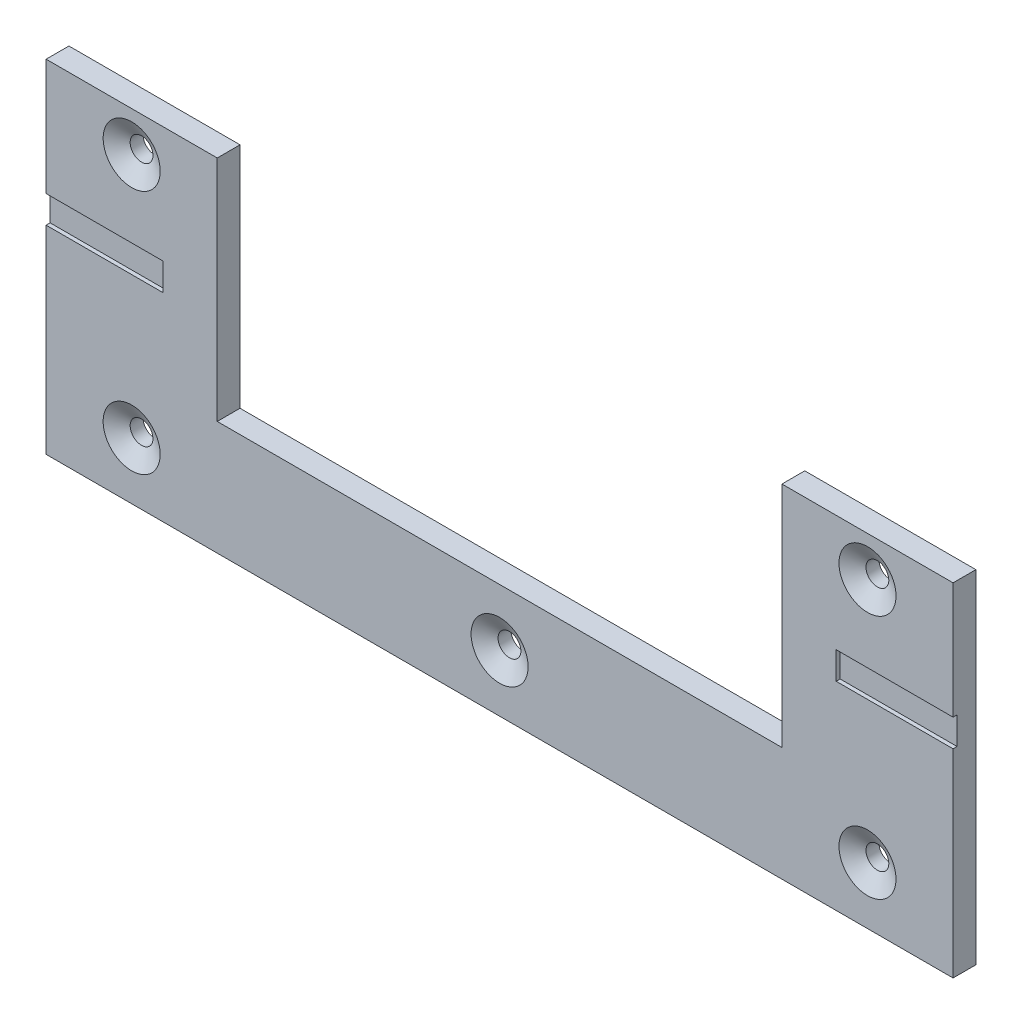
ISO-10303-21;
HEADER;
FILE_DESCRIPTION(('STEP AP214'),'2;1');
FILE_NAME('part.step','',(''),(''),'','','');
FILE_SCHEMA(('AUTOMOTIVE_DESIGN { 1 0 10303 214 1 1 1 1 }'));
ENDSEC;
DATA;
#1=APPLICATION_CONTEXT('core data for automotive mechanical design processes');
#2=APPLICATION_PROTOCOL_DEFINITION('international standard','automotive_design',2000,#1);
#3=PRODUCT_CONTEXT('',#1,'mechanical');
#4=PRODUCT('Part','Part','',(#3));
#5=PRODUCT_RELATED_PRODUCT_CATEGORY('part','',(#4));
#6=PRODUCT_DEFINITION_FORMATION('','',#4);
#7=PRODUCT_DEFINITION_CONTEXT('part definition',#1,'design');
#8=PRODUCT_DEFINITION('design','',#6,#7);
#9=PRODUCT_DEFINITION_SHAPE('','',#8);
#10=(LENGTH_UNIT() NAMED_UNIT(*) SI_UNIT(.MILLI.,.METRE.));
#11=(NAMED_UNIT(*) PLANE_ANGLE_UNIT() SI_UNIT($,.RADIAN.));
#12=(NAMED_UNIT(*) SI_UNIT($,.STERADIAN.) SOLID_ANGLE_UNIT());
#13=UNCERTAINTY_MEASURE_WITH_UNIT(LENGTH_MEASURE(1.E-05),#10,'distance_accuracy_value','');
#14=(GEOMETRIC_REPRESENTATION_CONTEXT(3) GLOBAL_UNCERTAINTY_ASSIGNED_CONTEXT((#13)) GLOBAL_UNIT_ASSIGNED_CONTEXT((#10,
#11,#12)) REPRESENTATION_CONTEXT('',''));
#15=CARTESIAN_POINT('',(0.,0.,0.));
#16=DIRECTION('',(0.,0.,1.));
#17=DIRECTION('',(1.,0.,0.));
#18=AXIS2_PLACEMENT_3D('',#15,#16,#17);
#19=CARTESIAN_POINT('',(0.,60.,4.));
#20=DIRECTION('',(0.,-1.,0.));
#21=DIRECTION('',(0.,0.,-1.));
#22=AXIS2_PLACEMENT_3D('',#19,#20,#21);
#23=PLANE('',#22);
#24=DIRECTION('',(-1.,0.,0.));
#25=VECTOR('',#24,1.);
#26=CARTESIAN_POINT('',(0.,60.,4.));
#27=LINE('',#26,#25);
#28=CARTESIAN_POINT('',(30.,60.,4.));
#29=VERTEX_POINT('',#28);
#30=CARTESIAN_POINT('',(0.,60.,4.));
#31=VERTEX_POINT('',#30);
#32=EDGE_CURVE('E279',#29,#31,#27,.T.);
#33=ORIENTED_EDGE('',*,*,#32,.F.);
#34=DIRECTION('',(0.,0.,1.));
#35=VECTOR('',#34,1.);
#36=CARTESIAN_POINT('',(30.,60.,0.));
#37=LINE('',#36,#35);
#38=CARTESIAN_POINT('',(30.,60.,0.));
#39=VERTEX_POINT('',#38);
#40=EDGE_CURVE('E180',#39,#29,#37,.T.);
#41=ORIENTED_EDGE('',*,*,#40,.F.);
#42=DIRECTION('',(-1.,0.,0.));
#43=VECTOR('',#42,1.);
#44=CARTESIAN_POINT('',(0.,60.,0.));
#45=LINE('',#44,#43);
#46=CARTESIAN_POINT('',(0.,60.,0.));
#47=VERTEX_POINT('',#46);
#48=EDGE_CURVE('E168',#39,#47,#45,.T.);
#49=ORIENTED_EDGE('',*,*,#48,.T.);
#50=DIRECTION('',(0.,0.,-1.));
#51=VECTOR('',#50,1.);
#52=CARTESIAN_POINT('',(0.,60.,4.));
#53=LINE('',#52,#51);
#54=EDGE_CURVE('E283',#31,#47,#53,.T.);
#55=ORIENTED_EDGE('',*,*,#54,.F.);
#56=EDGE_LOOP('',(#33,#41,#49,#55));
#57=FACE_BOUND('',#56,.T.);
#58=ADVANCED_FACE('F33',(#57),#23,.F.);
#59=CARTESIAN_POINT('',(0.,0.,4.));
#60=DIRECTION('',(0.,0.,-1.));
#61=DIRECTION('',(-1.,0.,0.));
#62=AXIS2_PLACEMENT_3D('',#59,#60,#61);
#63=PLANE('',#62);
#64=CARTESIAN_POINT('',(79.5,10.,4.));
#65=DIRECTION('',(0.,0.,-1.));
#66=DIRECTION('',(-1.,0.,0.));
#67=AXIS2_PLACEMENT_3D('',#64,#65,#66);
#68=CIRCLE('',#67,5.);
#69=CARTESIAN_POINT('',(74.5,10.,4.));
#70=VERTEX_POINT('',#69);
#71=EDGE_CURVE('E319',#70,#70,#68,.T.);
#72=ORIENTED_EDGE('',*,*,#71,.T.);
#73=EDGE_LOOP('',(#72));
#74=FACE_BOUND('',#73,.T.);
#75=CARTESIAN_POINT('',(144.,53.,4.));
#76=DIRECTION('',(0.,0.,-1.));
#77=DIRECTION('',(-1.,0.,0.));
#78=AXIS2_PLACEMENT_3D('',#75,#76,#77);
#79=CIRCLE('',#78,5.);
#80=CARTESIAN_POINT('',(139.,53.,4.));
#81=VERTEX_POINT('',#80);
#82=EDGE_CURVE('E316',#81,#81,#79,.T.);
#83=ORIENTED_EDGE('',*,*,#82,.T.);
#84=EDGE_LOOP('',(#83));
#85=FACE_BOUND('',#84,.T.);
#86=CARTESIAN_POINT('',(144.,10.,4.));
#87=DIRECTION('',(0.,0.,-1.));
#88=DIRECTION('',(-1.,0.,0.));
#89=AXIS2_PLACEMENT_3D('',#86,#87,#88);
#90=CIRCLE('',#89,5.);
#91=CARTESIAN_POINT('',(139.,10.,4.));
#92=VERTEX_POINT('',#91);
#93=EDGE_CURVE('E313',#92,#92,#90,.T.);
#94=ORIENTED_EDGE('',*,*,#93,.T.);
#95=EDGE_LOOP('',(#94));
#96=FACE_BOUND('',#95,.T.);
#97=CARTESIAN_POINT('',(15.,10.,4.));
#98=DIRECTION('',(0.,0.,-1.));
#99=DIRECTION('',(-1.,0.,0.));
#100=AXIS2_PLACEMENT_3D('',#97,#98,#99);
#101=CIRCLE('',#100,5.);
#102=CARTESIAN_POINT('',(20.,10.,4.));
#103=VERTEX_POINT('',#102);
#104=EDGE_CURVE('E310',#103,#103,#101,.T.);
#105=ORIENTED_EDGE('',*,*,#104,.T.);
#106=EDGE_LOOP('',(#105));
#107=FACE_BOUND('',#106,.T.);
#108=CARTESIAN_POINT('',(15.,53.,4.));
#109=DIRECTION('',(0.,0.,-1.));
#110=DIRECTION('',(-1.,0.,0.));
#111=AXIS2_PLACEMENT_3D('',#108,#109,#110);
#112=CIRCLE('',#111,5.);
#113=CARTESIAN_POINT('',(20.,53.,4.));
#114=VERTEX_POINT('',#113);
#115=EDGE_CURVE('E307',#114,#114,#112,.T.);
#116=ORIENTED_EDGE('',*,*,#115,.T.);
#117=EDGE_LOOP('',(#116));
#118=FACE_BOUND('',#117,.T.);
#119=DIRECTION('',(1.,0.,0.));
#120=VECTOR('',#119,1.);
#121=CARTESIAN_POINT('',(30.,20.,4.));
#122=LINE('',#121,#120);
#123=CARTESIAN_POINT('',(30.,20.,4.));
#124=VERTEX_POINT('',#123);
#125=CARTESIAN_POINT('',(129.,20.,4.));
#126=VERTEX_POINT('',#125);
#127=EDGE_CURVE('E171',#124,#126,#122,.T.);
#128=ORIENTED_EDGE('',*,*,#127,.F.);
#129=DIRECTION('',(0.,-1.,0.));
#130=VECTOR('',#129,1.);
#131=CARTESIAN_POINT('',(30.,60.,4.));
#132=LINE('',#131,#130);
#133=EDGE_CURVE('E153',#29,#124,#132,.T.);
#134=ORIENTED_EDGE('',*,*,#133,.F.);
#135=ORIENTED_EDGE('',*,*,#32,.T.);
#136=DIRECTION('',(0.,-1.,0.));
#137=VECTOR('',#136,1.);
#138=CARTESIAN_POINT('',(0.,0.,4.));
#139=LINE('',#138,#137);
#140=CARTESIAN_POINT('',(0.,39.6,4.));
#141=VERTEX_POINT('',#140);
#142=EDGE_CURVE('E269',#31,#141,#139,.T.);
#143=ORIENTED_EDGE('',*,*,#142,.T.);
#144=DIRECTION('',(1.,0.,0.));
#145=VECTOR('',#144,1.);
#146=CARTESIAN_POINT('',(20.5,39.6,4.));
#147=LINE('',#146,#145);
#148=CARTESIAN_POINT('',(20.5,39.6,4.));
#149=VERTEX_POINT('',#148);
#150=EDGE_CURVE('E243',#141,#149,#147,.T.);
#151=ORIENTED_EDGE('',*,*,#150,.T.);
#152=DIRECTION('',(0.,-1.,0.));
#153=VECTOR('',#152,1.);
#154=CARTESIAN_POINT('',(20.5,34.8,4.));
#155=LINE('',#154,#153);
#156=CARTESIAN_POINT('',(20.5,34.8,4.));
#157=VERTEX_POINT('',#156);
#158=EDGE_CURVE('E238',#149,#157,#155,.T.);
#159=ORIENTED_EDGE('',*,*,#158,.T.);
#160=DIRECTION('',(-1.,0.,0.));
#161=VECTOR('',#160,1.);
#162=CARTESIAN_POINT('',(20.5,34.8,4.));
#163=LINE('',#162,#161);
#164=CARTESIAN_POINT('',(0.,34.8,4.));
#165=VERTEX_POINT('',#164);
#166=EDGE_CURVE('E253',#157,#165,#163,.T.);
#167=ORIENTED_EDGE('',*,*,#166,.T.);
#168=CARTESIAN_POINT('',(0.,0.,4.));
#169=VERTEX_POINT('',#168);
#170=EDGE_CURVE('E273',#165,#169,#139,.T.);
#171=ORIENTED_EDGE('',*,*,#170,.T.);
#172=DIRECTION('',(1.,0.,0.));
#173=VECTOR('',#172,1.);
#174=CARTESIAN_POINT('',(0.,0.,4.));
#175=LINE('',#174,#173);
#176=CARTESIAN_POINT('',(159.,0.,4.));
#177=VERTEX_POINT('',#176);
#178=EDGE_CURVE('E272',#169,#177,#175,.T.);
#179=ORIENTED_EDGE('',*,*,#178,.T.);
#180=DIRECTION('',(0.,1.,0.));
#181=VECTOR('',#180,1.);
#182=CARTESIAN_POINT('',(159.,0.,4.));
#183=LINE('',#182,#181);
#184=CARTESIAN_POINT('',(159.,34.8,4.));
#185=VERTEX_POINT('',#184);
#186=EDGE_CURVE('E276',#177,#185,#183,.T.);
#187=ORIENTED_EDGE('',*,*,#186,.T.);
#188=DIRECTION('',(-1.,0.,0.));
#189=VECTOR('',#188,1.);
#190=CARTESIAN_POINT('',(138.5,34.8,4.));
#191=LINE('',#190,#189);
#192=CARTESIAN_POINT('',(138.5,34.8,4.));
#193=VERTEX_POINT('',#192);
#194=EDGE_CURVE('E215',#185,#193,#191,.T.);
#195=ORIENTED_EDGE('',*,*,#194,.T.);
#196=DIRECTION('',(0.,1.,0.));
#197=VECTOR('',#196,1.);
#198=CARTESIAN_POINT('',(138.5,34.8,4.));
#199=LINE('',#198,#197);
#200=CARTESIAN_POINT('',(138.5,39.6,4.));
#201=VERTEX_POINT('',#200);
#202=EDGE_CURVE('E208',#193,#201,#199,.T.);
#203=ORIENTED_EDGE('',*,*,#202,.T.);
#204=DIRECTION('',(1.,0.,0.));
#205=VECTOR('',#204,1.);
#206=CARTESIAN_POINT('',(138.5,39.6,4.));
#207=LINE('',#206,#205);
#208=CARTESIAN_POINT('',(159.,39.6,4.));
#209=VERTEX_POINT('',#208);
#210=EDGE_CURVE('E224',#201,#209,#207,.T.);
#211=ORIENTED_EDGE('',*,*,#210,.T.);
#212=CARTESIAN_POINT('',(159.,60.,4.));
#213=VERTEX_POINT('',#212);
#214=EDGE_CURVE('E275',#209,#213,#183,.T.);
#215=ORIENTED_EDGE('',*,*,#214,.T.);
#216=CARTESIAN_POINT('',(129.,60.,4.));
#217=VERTEX_POINT('',#216);
#218=EDGE_CURVE('E280',#213,#217,#27,.T.);
#219=ORIENTED_EDGE('',*,*,#218,.T.);
#220=DIRECTION('',(0.,1.,0.));
#221=VECTOR('',#220,1.);
#222=CARTESIAN_POINT('',(129.,60.,4.));
#223=LINE('',#222,#221);
#224=EDGE_CURVE('E169',#126,#217,#223,.T.);
#225=ORIENTED_EDGE('',*,*,#224,.F.);
#226=EDGE_LOOP('',(#128,#134,#135,#143,#151,#159,#167,#171,#179,#187,#195,#203,#211,#215,#219,#225));
#227=FACE_BOUND('',#226,.T.);
#228=ADVANCED_FACE('F347',(#74,#85,#96,#107,#118,#227),#63,.F.);
#229=CARTESIAN_POINT('',(159.,0.,4.));
#230=DIRECTION('',(-1.,0.,0.));
#231=DIRECTION('',(0.,0.,1.));
#232=AXIS2_PLACEMENT_3D('',#229,#230,#231);
#233=PLANE('',#232);
#234=DIRECTION('',(0.,0.,1.));
#235=VECTOR('',#234,1.);
#236=CARTESIAN_POINT('',(159.,39.6,3.3));
#237=LINE('',#236,#235);
#238=CARTESIAN_POINT('',(159.,39.6,3.3));
#239=VERTEX_POINT('',#238);
#240=EDGE_CURVE('E233',#239,#209,#237,.T.);
#241=ORIENTED_EDGE('',*,*,#240,.F.);
#242=DIRECTION('',(0.,-1.,0.));
#243=VECTOR('',#242,1.);
#244=CARTESIAN_POINT('',(159.,34.8,3.3));
#245=LINE('',#244,#243);
#246=CARTESIAN_POINT('',(159.,34.8,3.3));
#247=VERTEX_POINT('',#246);
#248=EDGE_CURVE('E217',#239,#247,#245,.T.);
#249=ORIENTED_EDGE('',*,*,#248,.T.);
#250=DIRECTION('',(0.,0.,1.));
#251=VECTOR('',#250,1.);
#252=CARTESIAN_POINT('',(159.,34.8,3.3));
#253=LINE('',#252,#251);
#254=EDGE_CURVE('E230',#247,#185,#253,.T.);
#255=ORIENTED_EDGE('',*,*,#254,.T.);
#256=ORIENTED_EDGE('',*,*,#186,.F.);
#257=DIRECTION('',(0.,0.,-1.));
#258=VECTOR('',#257,1.);
#259=CARTESIAN_POINT('',(159.,0.,4.));
#260=LINE('',#259,#258);
#261=CARTESIAN_POINT('',(159.,0.,0.));
#262=VERTEX_POINT('',#261);
#263=EDGE_CURVE('E298',#177,#262,#260,.T.);
#264=ORIENTED_EDGE('',*,*,#263,.T.);
#265=DIRECTION('',(0.,1.,0.));
#266=VECTOR('',#265,1.);
#267=CARTESIAN_POINT('',(159.,0.,0.));
#268=LINE('',#267,#266);
#269=CARTESIAN_POINT('',(159.,60.,0.));
#270=VERTEX_POINT('',#269);
#271=EDGE_CURVE('E288',#262,#270,#268,.T.);
#272=ORIENTED_EDGE('',*,*,#271,.T.);
#273=DIRECTION('',(0.,0.,-1.));
#274=VECTOR('',#273,1.);
#275=CARTESIAN_POINT('',(159.,60.,4.));
#276=LINE('',#275,#274);
#277=EDGE_CURVE('E295',#213,#270,#276,.T.);
#278=ORIENTED_EDGE('',*,*,#277,.F.);
#279=ORIENTED_EDGE('',*,*,#214,.F.);
#280=EDGE_LOOP('',(#241,#249,#255,#256,#264,#272,#278,#279));
#281=FACE_BOUND('',#280,.T.);
#282=ADVANCED_FACE('F354',(#281),#233,.F.);
#283=CARTESIAN_POINT('',(0.,0.,4.));
#284=DIRECTION('',(1.,0.,0.));
#285=DIRECTION('',(0.,0.,-1.));
#286=AXIS2_PLACEMENT_3D('',#283,#284,#285);
#287=PLANE('',#286);
#288=DIRECTION('',(0.,0.,1.));
#289=VECTOR('',#288,1.);
#290=CARTESIAN_POINT('',(0.,34.8,3.3));
#291=LINE('',#290,#289);
#292=CARTESIAN_POINT('',(0.,34.8,3.3));
#293=VERTEX_POINT('',#292);
#294=EDGE_CURVE('E263',#293,#165,#291,.T.);
#295=ORIENTED_EDGE('',*,*,#294,.F.);
#296=DIRECTION('',(0.,1.,0.));
#297=VECTOR('',#296,1.);
#298=CARTESIAN_POINT('',(0.,34.8,3.3));
#299=LINE('',#298,#297);
#300=CARTESIAN_POINT('',(0.,39.6,3.3));
#301=VERTEX_POINT('',#300);
#302=EDGE_CURVE('E245',#293,#301,#299,.T.);
#303=ORIENTED_EDGE('',*,*,#302,.T.);
#304=DIRECTION('',(0.,0.,1.));
#305=VECTOR('',#304,1.);
#306=CARTESIAN_POINT('',(0.,39.6,3.3));
#307=LINE('',#306,#305);
#308=EDGE_CURVE('E260',#301,#141,#307,.T.);
#309=ORIENTED_EDGE('',*,*,#308,.T.);
#310=ORIENTED_EDGE('',*,*,#142,.F.);
#311=ORIENTED_EDGE('',*,*,#54,.T.);
#312=DIRECTION('',(0.,-1.,0.));
#313=VECTOR('',#312,1.);
#314=CARTESIAN_POINT('',(0.,0.,0.));
#315=LINE('',#314,#313);
#316=CARTESIAN_POINT('',(0.,0.,0.));
#317=VERTEX_POINT('',#316);
#318=EDGE_CURVE('E268',#47,#317,#315,.T.);
#319=ORIENTED_EDGE('',*,*,#318,.T.);
#320=DIRECTION('',(0.,0.,-1.));
#321=VECTOR('',#320,1.);
#322=CARTESIAN_POINT('',(0.,0.,4.));
#323=LINE('',#322,#321);
#324=EDGE_CURVE('E301',#169,#317,#323,.T.);
#325=ORIENTED_EDGE('',*,*,#324,.F.);
#326=ORIENTED_EDGE('',*,*,#170,.F.);
#327=EDGE_LOOP('',(#295,#303,#309,#310,#311,#319,#325,#326));
#328=FACE_BOUND('',#327,.T.);
#329=ADVANCED_FACE('F369',(#328),#287,.F.);
#330=CARTESIAN_POINT('',(0.,0.,4.));
#331=DIRECTION('',(0.,1.,0.));
#332=DIRECTION('',(0.,0.,1.));
#333=AXIS2_PLACEMENT_3D('',#330,#331,#332);
#334=PLANE('',#333);
#335=DIRECTION('',(1.,0.,0.));
#336=VECTOR('',#335,1.);
#337=CARTESIAN_POINT('',(0.,0.,0.));
#338=LINE('',#337,#336);
#339=EDGE_CURVE('E286',#317,#262,#338,.T.);
#340=ORIENTED_EDGE('',*,*,#339,.T.);
#341=ORIENTED_EDGE('',*,*,#263,.F.);
#342=ORIENTED_EDGE('',*,*,#178,.F.);
#343=ORIENTED_EDGE('',*,*,#324,.T.);
#344=EDGE_LOOP('',(#340,#341,#342,#343));
#345=FACE_BOUND('',#344,.T.);
#346=ADVANCED_FACE('F361',(#345),#334,.F.);
#347=CARTESIAN_POINT('',(129.,60.,0.));
#348=VERTEX_POINT('',#347);
#349=EDGE_CURVE('E290',#270,#348,#45,.T.);
#350=ORIENTED_EDGE('',*,*,#349,.T.);
#351=DIRECTION('',(0.,0.,1.));
#352=VECTOR('',#351,1.);
#353=CARTESIAN_POINT('',(129.,60.,0.));
#354=LINE('',#353,#352);
#355=EDGE_CURVE('E183',#348,#217,#354,.T.);
#356=ORIENTED_EDGE('',*,*,#355,.T.);
#357=ORIENTED_EDGE('',*,*,#218,.F.);
#358=ORIENTED_EDGE('',*,*,#277,.T.);
#359=EDGE_LOOP('',(#350,#356,#357,#358));
#360=FACE_BOUND('',#359,.T.);
#361=ADVANCED_FACE('F350',(#360),#23,.F.);
#362=CARTESIAN_POINT('',(0.,0.,0.));
#363=DIRECTION('',(0.,0.,-1.));
#364=DIRECTION('',(-1.,0.,0.));
#365=AXIS2_PLACEMENT_3D('',#362,#363,#364);
#366=PLANE('',#365);
#367=CARTESIAN_POINT('',(79.5,10.,0.));
#368=DIRECTION('',(0.,0.,1.));
#369=DIRECTION('',(1.,0.,0.));
#370=AXIS2_PLACEMENT_3D('',#367,#368,#369);
#371=CIRCLE('',#370,2.);
#372=CARTESIAN_POINT('',(81.5,10.,0.));
#373=VERTEX_POINT('',#372);
#374=EDGE_CURVE('E679',#373,#373,#371,.T.);
#375=ORIENTED_EDGE('',*,*,#374,.T.);
#376=EDGE_LOOP('',(#375));
#377=FACE_BOUND('',#376,.T.);
#378=CARTESIAN_POINT('',(144.,53.,0.));
#379=DIRECTION('',(0.,0.,1.));
#380=DIRECTION('',(1.,0.,0.));
#381=AXIS2_PLACEMENT_3D('',#378,#379,#380);
#382=CIRCLE('',#381,2.);
#383=CARTESIAN_POINT('',(146.,53.,0.));
#384=VERTEX_POINT('',#383);
#385=EDGE_CURVE('E676',#384,#384,#382,.T.);
#386=ORIENTED_EDGE('',*,*,#385,.T.);
#387=EDGE_LOOP('',(#386));
#388=FACE_BOUND('',#387,.T.);
#389=CARTESIAN_POINT('',(15.,53.,0.));
#390=DIRECTION('',(0.,0.,1.));
#391=DIRECTION('',(1.,0.,0.));
#392=AXIS2_PLACEMENT_3D('',#389,#390,#391);
#393=CIRCLE('',#392,2.);
#394=CARTESIAN_POINT('',(17.,53.,0.));
#395=VERTEX_POINT('',#394);
#396=EDGE_CURVE('E678',#395,#395,#393,.T.);
#397=ORIENTED_EDGE('',*,*,#396,.T.);
#398=EDGE_LOOP('',(#397));
#399=FACE_BOUND('',#398,.T.);
#400=CARTESIAN_POINT('',(144.,10.,0.));
#401=DIRECTION('',(0.,0.,1.));
#402=DIRECTION('',(1.,0.,0.));
#403=AXIS2_PLACEMENT_3D('',#400,#401,#402);
#404=CIRCLE('',#403,2.);
#405=CARTESIAN_POINT('',(146.,10.,0.));
#406=VERTEX_POINT('',#405);
#407=EDGE_CURVE('E682',#406,#406,#404,.T.);
#408=ORIENTED_EDGE('',*,*,#407,.T.);
#409=EDGE_LOOP('',(#408));
#410=FACE_BOUND('',#409,.T.);
#411=CARTESIAN_POINT('',(15.,10.,0.));
#412=DIRECTION('',(0.,0.,1.));
#413=DIRECTION('',(1.,0.,0.));
#414=AXIS2_PLACEMENT_3D('',#411,#412,#413);
#415=CIRCLE('',#414,2.);
#416=CARTESIAN_POINT('',(17.,10.,0.));
#417=VERTEX_POINT('',#416);
#418=EDGE_CURVE('E174',#417,#417,#415,.T.);
#419=ORIENTED_EDGE('',*,*,#418,.T.);
#420=EDGE_LOOP('',(#419));
#421=FACE_BOUND('',#420,.T.);
#422=DIRECTION('',(0.,-1.,0.));
#423=VECTOR('',#422,1.);
#424=CARTESIAN_POINT('',(30.,60.,0.));
#425=LINE('',#424,#423);
#426=CARTESIAN_POINT('',(30.,20.,0.));
#427=VERTEX_POINT('',#426);
#428=EDGE_CURVE('E150',#39,#427,#425,.T.);
#429=ORIENTED_EDGE('',*,*,#428,.T.);
#430=DIRECTION('',(1.,0.,0.));
#431=VECTOR('',#430,1.);
#432=CARTESIAN_POINT('',(30.,20.,0.));
#433=LINE('',#432,#431);
#434=CARTESIAN_POINT('',(129.,20.,0.));
#435=VERTEX_POINT('',#434);
#436=EDGE_CURVE('E160',#427,#435,#433,.T.);
#437=ORIENTED_EDGE('',*,*,#436,.T.);
#438=DIRECTION('',(0.,1.,0.));
#439=VECTOR('',#438,1.);
#440=CARTESIAN_POINT('',(129.,60.,0.));
#441=LINE('',#440,#439);
#442=EDGE_CURVE('E48',#435,#348,#441,.T.);
#443=ORIENTED_EDGE('',*,*,#442,.T.);
#444=ORIENTED_EDGE('',*,*,#349,.F.);
#445=ORIENTED_EDGE('',*,*,#271,.F.);
#446=ORIENTED_EDGE('',*,*,#339,.F.);
#447=ORIENTED_EDGE('',*,*,#318,.F.);
#448=ORIENTED_EDGE('',*,*,#48,.F.);
#449=EDGE_LOOP('',(#429,#437,#443,#444,#445,#446,#447,#448));
#450=FACE_BOUND('',#449,.T.);
#451=CARTESIAN_POINT('',(146.5,43.1872690837141,0.));
#452=DIRECTION('',(0.,0.,-1.));
#453=DIRECTION('',(-1.,0.,0.));
#454=AXIS2_PLACEMENT_3D('',#451,#452,#453);
#455=CIRCLE('',#454,5.25);
#456=CARTESIAN_POINT('',(141.25,43.1872690837141,0.));
#457=VERTEX_POINT('',#456);
#458=EDGE_CURVE('E182',#457,#457,#455,.T.);
#459=ORIENTED_EDGE('',*,*,#458,.F.);
#460=EDGE_LOOP('',(#459));
#461=FACE_BOUND('',#460,.T.);
#462=CARTESIAN_POINT('',(146.5,31.2046949924377,0.));
#463=DIRECTION('',(0.,0.,-1.));
#464=DIRECTION('',(-1.,0.,0.));
#465=AXIS2_PLACEMENT_3D('',#462,#463,#464);
#466=CIRCLE('',#465,5.24999999999997);
#467=CARTESIAN_POINT('',(141.25,31.2046949924377,0.));
#468=VERTEX_POINT('',#467);
#469=EDGE_CURVE('E190',#468,#468,#466,.T.);
#470=ORIENTED_EDGE('',*,*,#469,.F.);
#471=EDGE_LOOP('',(#470));
#472=FACE_BOUND('',#471,.T.);
#473=CARTESIAN_POINT('',(12.5,43.1872690837141,0.));
#474=DIRECTION('',(0.,0.,-1.));
#475=DIRECTION('',(-1.,0.,0.));
#476=AXIS2_PLACEMENT_3D('',#473,#474,#475);
#477=CIRCLE('',#476,5.25);
#478=CARTESIAN_POINT('',(7.25,43.1872690837141,0.));
#479=VERTEX_POINT('',#478);
#480=EDGE_CURVE('E196',#479,#479,#477,.T.);
#481=ORIENTED_EDGE('',*,*,#480,.F.);
#482=EDGE_LOOP('',(#481));
#483=FACE_BOUND('',#482,.T.);
#484=CARTESIAN_POINT('',(12.5,31.1872690837141,0.));
#485=DIRECTION('',(0.,0.,-1.));
#486=DIRECTION('',(-1.,0.,0.));
#487=AXIS2_PLACEMENT_3D('',#484,#485,#486);
#488=CIRCLE('',#487,5.25);
#489=CARTESIAN_POINT('',(7.25000000000001,31.1872690837141,0.));
#490=VERTEX_POINT('',#489);
#491=EDGE_CURVE('E202',#490,#490,#488,.T.);
#492=ORIENTED_EDGE('',*,*,#491,.F.);
#493=EDGE_LOOP('',(#492));
#494=FACE_BOUND('',#493,.T.);
#495=ADVANCED_FACE('F165',(#377,#388,#399,#410,#421,#450,#461,#472,#483,#494),#366,.T.);
#496=CARTESIAN_POINT('',(20.5,34.8,3.3));
#497=DIRECTION('',(-1.,0.,0.));
#498=DIRECTION('',(0.,0.,1.));
#499=AXIS2_PLACEMENT_3D('',#496,#497,#498);
#500=PLANE('',#499);
#501=ORIENTED_EDGE('',*,*,#158,.F.);
#502=DIRECTION('',(0.,0.,1.));
#503=VECTOR('',#502,1.);
#504=CARTESIAN_POINT('',(20.5,39.6,3.3));
#505=LINE('',#504,#503);
#506=CARTESIAN_POINT('',(20.5,39.6,3.3));
#507=VERTEX_POINT('',#506);
#508=EDGE_CURVE('E250',#507,#149,#505,.T.);
#509=ORIENTED_EDGE('',*,*,#508,.F.);
#510=DIRECTION('',(0.,-1.,0.));
#511=VECTOR('',#510,1.);
#512=CARTESIAN_POINT('',(20.5,34.8,3.3));
#513=LINE('',#512,#511);
#514=CARTESIAN_POINT('',(20.5,34.8,3.3));
#515=VERTEX_POINT('',#514);
#516=EDGE_CURVE('E239',#507,#515,#513,.T.);
#517=ORIENTED_EDGE('',*,*,#516,.T.);
#518=DIRECTION('',(0.,0.,1.));
#519=VECTOR('',#518,1.);
#520=CARTESIAN_POINT('',(20.5,34.8,3.3));
#521=LINE('',#520,#519);
#522=EDGE_CURVE('E265',#515,#157,#521,.T.);
#523=ORIENTED_EDGE('',*,*,#522,.T.);
#524=EDGE_LOOP('',(#501,#509,#517,#523));
#525=FACE_BOUND('',#524,.T.);
#526=ADVANCED_FACE('F367',(#525),#500,.T.);
#527=CARTESIAN_POINT('',(20.5,34.8,3.3));
#528=DIRECTION('',(0.,1.,0.));
#529=DIRECTION('',(0.,0.,1.));
#530=AXIS2_PLACEMENT_3D('',#527,#528,#529);
#531=PLANE('',#530);
#532=ORIENTED_EDGE('',*,*,#166,.F.);
#533=ORIENTED_EDGE('',*,*,#522,.F.);
#534=DIRECTION('',(-1.,0.,0.));
#535=VECTOR('',#534,1.);
#536=CARTESIAN_POINT('',(20.5,34.8,3.3));
#537=LINE('',#536,#535);
#538=EDGE_CURVE('E242',#515,#293,#537,.T.);
#539=ORIENTED_EDGE('',*,*,#538,.T.);
#540=ORIENTED_EDGE('',*,*,#294,.T.);
#541=EDGE_LOOP('',(#532,#533,#539,#540));
#542=FACE_BOUND('',#541,.T.);
#543=ADVANCED_FACE('F456',(#542),#531,.T.);
#544=CARTESIAN_POINT('',(20.5,39.6,3.3));
#545=DIRECTION('',(0.,-1.,0.));
#546=DIRECTION('',(0.,0.,-1.));
#547=AXIS2_PLACEMENT_3D('',#544,#545,#546);
#548=PLANE('',#547);
#549=ORIENTED_EDGE('',*,*,#150,.F.);
#550=ORIENTED_EDGE('',*,*,#308,.F.);
#551=DIRECTION('',(1.,0.,0.));
#552=VECTOR('',#551,1.);
#553=CARTESIAN_POINT('',(20.5,39.6,3.3));
#554=LINE('',#553,#552);
#555=EDGE_CURVE('E248',#301,#507,#554,.T.);
#556=ORIENTED_EDGE('',*,*,#555,.T.);
#557=ORIENTED_EDGE('',*,*,#508,.T.);
#558=EDGE_LOOP('',(#549,#550,#556,#557));
#559=FACE_BOUND('',#558,.T.);
#560=ADVANCED_FACE('F452',(#559),#548,.T.);
#561=CARTESIAN_POINT('',(0.,0.,3.3));
#562=DIRECTION('',(0.,0.,1.));
#563=DIRECTION('',(1.,0.,0.));
#564=AXIS2_PLACEMENT_3D('',#561,#562,#563);
#565=PLANE('',#564);
#566=ORIENTED_EDGE('',*,*,#516,.F.);
#567=ORIENTED_EDGE('',*,*,#555,.F.);
#568=ORIENTED_EDGE('',*,*,#302,.F.);
#569=ORIENTED_EDGE('',*,*,#538,.F.);
#570=EDGE_LOOP('',(#566,#567,#568,#569));
#571=FACE_BOUND('',#570,.T.);
#572=ADVANCED_FACE('F448',(#571),#565,.T.);
#573=CARTESIAN_POINT('',(138.5,34.8,3.3));
#574=DIRECTION('',(1.,0.,0.));
#575=DIRECTION('',(0.,0.,-1.));
#576=AXIS2_PLACEMENT_3D('',#573,#574,#575);
#577=PLANE('',#576);
#578=ORIENTED_EDGE('',*,*,#202,.F.);
#579=DIRECTION('',(0.,0.,1.));
#580=VECTOR('',#579,1.);
#581=CARTESIAN_POINT('',(138.5,34.8,3.3));
#582=LINE('',#581,#580);
#583=CARTESIAN_POINT('',(138.5,34.8,3.3));
#584=VERTEX_POINT('',#583);
#585=EDGE_CURVE('E221',#584,#193,#582,.T.);
#586=ORIENTED_EDGE('',*,*,#585,.F.);
#587=DIRECTION('',(0.,1.,0.));
#588=VECTOR('',#587,1.);
#589=CARTESIAN_POINT('',(138.5,34.8,3.3));
#590=LINE('',#589,#588);
#591=CARTESIAN_POINT('',(138.5,39.6,3.3));
#592=VERTEX_POINT('',#591);
#593=EDGE_CURVE('E211',#584,#592,#590,.T.);
#594=ORIENTED_EDGE('',*,*,#593,.T.);
#595=DIRECTION('',(0.,0.,1.));
#596=VECTOR('',#595,1.);
#597=CARTESIAN_POINT('',(138.5,39.6,3.3));
#598=LINE('',#597,#596);
#599=EDGE_CURVE('E235',#592,#201,#598,.T.);
#600=ORIENTED_EDGE('',*,*,#599,.T.);
#601=EDGE_LOOP('',(#578,#586,#594,#600));
#602=FACE_BOUND('',#601,.T.);
#603=ADVANCED_FACE('F444',(#602),#577,.T.);
#604=CARTESIAN_POINT('',(138.5,39.6,3.3));
#605=DIRECTION('',(0.,-1.,0.));
#606=DIRECTION('',(0.,0.,-1.));
#607=AXIS2_PLACEMENT_3D('',#604,#605,#606);
#608=PLANE('',#607);
#609=ORIENTED_EDGE('',*,*,#210,.F.);
#610=ORIENTED_EDGE('',*,*,#599,.F.);
#611=DIRECTION('',(1.,0.,0.));
#612=VECTOR('',#611,1.);
#613=CARTESIAN_POINT('',(138.5,39.6,3.3));
#614=LINE('',#613,#612);
#615=EDGE_CURVE('E214',#592,#239,#614,.T.);
#616=ORIENTED_EDGE('',*,*,#615,.T.);
#617=ORIENTED_EDGE('',*,*,#240,.T.);
#618=EDGE_LOOP('',(#609,#610,#616,#617));
#619=FACE_BOUND('',#618,.T.);
#620=ADVANCED_FACE('F440',(#619),#608,.T.);
#621=CARTESIAN_POINT('',(138.5,34.8,3.3));
#622=DIRECTION('',(0.,1.,0.));
#623=DIRECTION('',(-1.,0.,0.));
#624=AXIS2_PLACEMENT_3D('',#621,#622,#623);
#625=PLANE('',#624);
#626=ORIENTED_EDGE('',*,*,#194,.F.);
#627=ORIENTED_EDGE('',*,*,#254,.F.);
#628=DIRECTION('',(-1.,0.,0.));
#629=VECTOR('',#628,1.);
#630=CARTESIAN_POINT('',(138.5,34.8,3.3));
#631=LINE('',#630,#629);
#632=EDGE_CURVE('E56',#247,#584,#631,.T.);
#633=ORIENTED_EDGE('',*,*,#632,.T.);
#634=ORIENTED_EDGE('',*,*,#585,.T.);
#635=EDGE_LOOP('',(#626,#627,#633,#634));
#636=FACE_BOUND('',#635,.T.);
#637=ADVANCED_FACE('F437',(#636),#625,.T.);
#638=CARTESIAN_POINT('',(0.,0.,3.3));
#639=DIRECTION('',(0.,0.,-1.));
#640=DIRECTION('',(-1.,0.,0.));
#641=AXIS2_PLACEMENT_3D('',#638,#639,#640);
#642=PLANE('',#641);
#643=ORIENTED_EDGE('',*,*,#593,.F.);
#644=ORIENTED_EDGE('',*,*,#632,.F.);
#645=ORIENTED_EDGE('',*,*,#248,.F.);
#646=ORIENTED_EDGE('',*,*,#615,.F.);
#647=EDGE_LOOP('',(#643,#644,#645,#646));
#648=FACE_BOUND('',#647,.T.);
#649=ADVANCED_FACE('F433',(#648),#642,.F.);
#650=CARTESIAN_POINT('',(12.5,31.1872690837141,2.3));
#651=DIRECTION('',(0.,0.,-1.));
#652=DIRECTION('',(-1.,0.,0.));
#653=AXIS2_PLACEMENT_3D('',#650,#651,#652);
#654=CYLINDRICAL_SURFACE('',#653,5.25);
#655=CARTESIAN_POINT('',(12.5,31.1872690837141,2.3));
#656=DIRECTION('',(0.,0.,-1.));
#657=DIRECTION('',(-1.,0.,0.));
#658=AXIS2_PLACEMENT_3D('',#655,#656,#657);
#659=CIRCLE('',#658,5.25);
#660=CARTESIAN_POINT('',(7.25000000000001,31.1872690837141,2.3));
#661=VERTEX_POINT('',#660);
#662=EDGE_CURVE('E205',#661,#661,#659,.T.);
#663=ORIENTED_EDGE('',*,*,#662,.F.);
#664=EDGE_LOOP('',(#663));
#665=FACE_BOUND('',#664,.T.);
#666=ORIENTED_EDGE('',*,*,#491,.T.);
#667=EDGE_LOOP('',(#666));
#668=FACE_BOUND('',#667,.T.);
#669=ADVANCED_FACE('F429',(#665,#668),#654,.F.);
#670=CARTESIAN_POINT('',(12.5,31.1872690837141,2.3));
#671=DIRECTION('',(0.,0.,-1.));
#672=DIRECTION('',(-1.,0.,0.));
#673=AXIS2_PLACEMENT_3D('',#670,#671,#672);
#674=PLANE('',#673);
#675=ORIENTED_EDGE('',*,*,#662,.T.);
#676=EDGE_LOOP('',(#675));
#677=FACE_BOUND('',#676,.T.);
#678=ADVANCED_FACE('F425',(#677),#674,.T.);
#679=CARTESIAN_POINT('',(12.5,43.1872690837141,2.3));
#680=DIRECTION('',(0.,0.,-1.));
#681=DIRECTION('',(-1.,0.,0.));
#682=AXIS2_PLACEMENT_3D('',#679,#680,#681);
#683=CYLINDRICAL_SURFACE('',#682,5.25);
#684=CARTESIAN_POINT('',(12.5,43.1872690837141,2.3));
#685=DIRECTION('',(0.,0.,-1.));
#686=DIRECTION('',(-1.,0.,0.));
#687=AXIS2_PLACEMENT_3D('',#684,#685,#686);
#688=CIRCLE('',#687,5.25);
#689=CARTESIAN_POINT('',(7.25,43.1872690837141,2.3));
#690=VERTEX_POINT('',#689);
#691=EDGE_CURVE('E199',#690,#690,#688,.T.);
#692=ORIENTED_EDGE('',*,*,#691,.F.);
#693=EDGE_LOOP('',(#692));
#694=FACE_BOUND('',#693,.T.);
#695=ORIENTED_EDGE('',*,*,#480,.T.);
#696=EDGE_LOOP('',(#695));
#697=FACE_BOUND('',#696,.T.);
#698=ADVANCED_FACE('F421',(#694,#697),#683,.F.);
#699=CARTESIAN_POINT('',(12.5,43.1872690837141,2.3));
#700=DIRECTION('',(0.,0.,-1.));
#701=DIRECTION('',(-1.,0.,0.));
#702=AXIS2_PLACEMENT_3D('',#699,#700,#701);
#703=PLANE('',#702);
#704=ORIENTED_EDGE('',*,*,#691,.T.);
#705=EDGE_LOOP('',(#704));
#706=FACE_BOUND('',#705,.T.);
#707=ADVANCED_FACE('F417',(#706),#703,.T.);
#708=CARTESIAN_POINT('',(146.5,31.2046949924377,2.3));
#709=DIRECTION('',(0.,0.,-1.));
#710=DIRECTION('',(-1.,0.,0.));
#711=AXIS2_PLACEMENT_3D('',#708,#709,#710);
#712=CYLINDRICAL_SURFACE('',#711,5.24999999999997);
#713=CARTESIAN_POINT('',(146.5,31.2046949924377,2.3));
#714=DIRECTION('',(0.,0.,-1.));
#715=DIRECTION('',(-1.,0.,0.));
#716=AXIS2_PLACEMENT_3D('',#713,#714,#715);
#717=CIRCLE('',#716,5.24999999999997);
#718=CARTESIAN_POINT('',(141.25,31.2046949924377,2.3));
#719=VERTEX_POINT('',#718);
#720=EDGE_CURVE('E193',#719,#719,#717,.T.);
#721=ORIENTED_EDGE('',*,*,#720,.F.);
#722=EDGE_LOOP('',(#721));
#723=FACE_BOUND('',#722,.T.);
#724=ORIENTED_EDGE('',*,*,#469,.T.);
#725=EDGE_LOOP('',(#724));
#726=FACE_BOUND('',#725,.T.);
#727=ADVANCED_FACE('F413',(#723,#726),#712,.F.);
#728=CARTESIAN_POINT('',(146.5,31.2046949924377,2.3));
#729=DIRECTION('',(0.,0.,-1.));
#730=DIRECTION('',(-1.,0.,0.));
#731=AXIS2_PLACEMENT_3D('',#728,#729,#730);
#732=PLANE('',#731);
#733=ORIENTED_EDGE('',*,*,#720,.T.);
#734=EDGE_LOOP('',(#733));
#735=FACE_BOUND('',#734,.T.);
#736=ADVANCED_FACE('F409',(#735),#732,.T.);
#737=CARTESIAN_POINT('',(146.5,43.1872690837141,2.3));
#738=DIRECTION('',(0.,0.,-1.));
#739=DIRECTION('',(-1.,0.,0.));
#740=AXIS2_PLACEMENT_3D('',#737,#738,#739);
#741=CYLINDRICAL_SURFACE('',#740,5.25);
#742=CARTESIAN_POINT('',(146.5,43.1872690837141,2.3));
#743=DIRECTION('',(0.,0.,-1.));
#744=DIRECTION('',(-1.,0.,0.));
#745=AXIS2_PLACEMENT_3D('',#742,#743,#744);
#746=CIRCLE('',#745,5.25);
#747=CARTESIAN_POINT('',(141.25,43.1872690837141,2.3));
#748=VERTEX_POINT('',#747);
#749=EDGE_CURVE('E187',#748,#748,#746,.T.);
#750=ORIENTED_EDGE('',*,*,#749,.F.);
#751=EDGE_LOOP('',(#750));
#752=FACE_BOUND('',#751,.T.);
#753=ORIENTED_EDGE('',*,*,#458,.T.);
#754=EDGE_LOOP('',(#753));
#755=FACE_BOUND('',#754,.T.);
#756=ADVANCED_FACE('F405',(#752,#755),#741,.F.);
#757=CARTESIAN_POINT('',(146.5,43.1872690837141,2.3));
#758=DIRECTION('',(0.,0.,-1.));
#759=DIRECTION('',(-1.,0.,0.));
#760=AXIS2_PLACEMENT_3D('',#757,#758,#759);
#761=PLANE('',#760);
#762=ORIENTED_EDGE('',*,*,#749,.T.);
#763=EDGE_LOOP('',(#762));
#764=FACE_BOUND('',#763,.T.);
#765=ADVANCED_FACE('F398',(#764),#761,.T.);
#766=CARTESIAN_POINT('',(30.,60.,0.));
#767=DIRECTION('',(-1.,0.,0.));
#768=DIRECTION('',(0.,-1.,0.));
#769=AXIS2_PLACEMENT_3D('',#766,#767,#768);
#770=PLANE('',#769);
#771=ORIENTED_EDGE('',*,*,#133,.T.);
#772=DIRECTION('',(0.,0.,1.));
#773=VECTOR('',#772,1.);
#774=CARTESIAN_POINT('',(30.,20.,0.));
#775=LINE('',#774,#773);
#776=EDGE_CURVE('E146',#427,#124,#775,.T.);
#777=ORIENTED_EDGE('',*,*,#776,.F.);
#778=ORIENTED_EDGE('',*,*,#428,.F.);
#779=ORIENTED_EDGE('',*,*,#40,.T.);
#780=EDGE_LOOP('',(#771,#777,#778,#779));
#781=FACE_BOUND('',#780,.T.);
#782=ADVANCED_FACE('F148',(#781),#770,.F.);
#783=CARTESIAN_POINT('',(129.,60.,0.));
#784=DIRECTION('',(1.,0.,0.));
#785=DIRECTION('',(0.,0.,-1.));
#786=AXIS2_PLACEMENT_3D('',#783,#784,#785);
#787=PLANE('',#786);
#788=ORIENTED_EDGE('',*,*,#224,.T.);
#789=ORIENTED_EDGE('',*,*,#355,.F.);
#790=ORIENTED_EDGE('',*,*,#442,.F.);
#791=DIRECTION('',(0.,0.,1.));
#792=VECTOR('',#791,1.);
#793=CARTESIAN_POINT('',(129.,20.,0.));
#794=LINE('',#793,#792);
#795=EDGE_CURVE('E157',#435,#126,#794,.T.);
#796=ORIENTED_EDGE('',*,*,#795,.T.);
#797=EDGE_LOOP('',(#788,#789,#790,#796));
#798=FACE_BOUND('',#797,.T.);
#799=ADVANCED_FACE('F390',(#798),#787,.F.);
#800=CARTESIAN_POINT('',(30.,20.,0.));
#801=DIRECTION('',(0.,-1.,0.));
#802=DIRECTION('',(0.,0.,-1.));
#803=AXIS2_PLACEMENT_3D('',#800,#801,#802);
#804=PLANE('',#803);
#805=ORIENTED_EDGE('',*,*,#127,.T.);
#806=ORIENTED_EDGE('',*,*,#795,.F.);
#807=ORIENTED_EDGE('',*,*,#436,.F.);
#808=ORIENTED_EDGE('',*,*,#776,.T.);
#809=EDGE_LOOP('',(#805,#806,#807,#808));
#810=FACE_BOUND('',#809,.T.);
#811=ADVANCED_FACE('F161',(#810),#804,.F.);
#812=CARTESIAN_POINT('',(15.,10.,0.));
#813=DIRECTION('',(0.,0.,1.));
#814=DIRECTION('',(1.,0.,0.));
#815=AXIS2_PLACEMENT_3D('',#812,#813,#814);
#816=CYLINDRICAL_SURFACE('',#815,2.);
#817=CARTESIAN_POINT('',(15.,10.,2.26794919243114));
#818=DIRECTION('',(0.,0.,-1.));
#819=DIRECTION('',(-1.,0.,0.));
#820=AXIS2_PLACEMENT_3D('',#817,#818,#819);
#821=CIRCLE('',#820,2.);
#822=CARTESIAN_POINT('',(17.,10.,2.26794919243114));
#823=VERTEX_POINT('',#822);
#824=EDGE_CURVE('E41',#823,#823,#821,.F.);
#825=ORIENTED_EDGE('',*,*,#824,.T.);
#826=EDGE_LOOP('',(#825));
#827=FACE_BOUND('',#826,.T.);
#828=ORIENTED_EDGE('',*,*,#418,.F.);
#829=EDGE_LOOP('',(#828));
#830=FACE_BOUND('',#829,.T.);
#831=ADVANCED_FACE('F330',(#827,#830),#816,.F.);
#832=CARTESIAN_POINT('',(144.,10.,0.));
#833=DIRECTION('',(0.,0.,1.));
#834=DIRECTION('',(1.,0.,0.));
#835=AXIS2_PLACEMENT_3D('',#832,#833,#834);
#836=CYLINDRICAL_SURFACE('',#835,2.);
#837=CARTESIAN_POINT('',(144.,10.,2.26794919243113));
#838=DIRECTION('',(0.,0.,-1.));
#839=DIRECTION('',(-1.,0.,0.));
#840=AXIS2_PLACEMENT_3D('',#837,#838,#839);
#841=CIRCLE('',#840,2.);
#842=CARTESIAN_POINT('',(142.,10.,2.26794919243113));
#843=VERTEX_POINT('',#842);
#844=EDGE_CURVE('E325',#843,#843,#841,.F.);
#845=ORIENTED_EDGE('',*,*,#844,.T.);
#846=EDGE_LOOP('',(#845));
#847=FACE_BOUND('',#846,.T.);
#848=ORIENTED_EDGE('',*,*,#407,.F.);
#849=EDGE_LOOP('',(#848));
#850=FACE_BOUND('',#849,.T.);
#851=ADVANCED_FACE('F575',(#847,#850),#836,.F.);
#852=CARTESIAN_POINT('',(15.,53.,0.));
#853=DIRECTION('',(0.,0.,1.));
#854=DIRECTION('',(1.,0.,0.));
#855=AXIS2_PLACEMENT_3D('',#852,#853,#854);
#856=CYLINDRICAL_SURFACE('',#855,2.);
#857=CARTESIAN_POINT('',(15.,53.,2.26794919243114));
#858=DIRECTION('',(0.,0.,-1.));
#859=DIRECTION('',(-1.,0.,0.));
#860=AXIS2_PLACEMENT_3D('',#857,#858,#859);
#861=CIRCLE('',#860,2.);
#862=CARTESIAN_POINT('',(17.,53.,2.26794919243114));
#863=VERTEX_POINT('',#862);
#864=EDGE_CURVE('E11',#863,#863,#861,.F.);
#865=ORIENTED_EDGE('',*,*,#864,.T.);
#866=EDGE_LOOP('',(#865));
#867=FACE_BOUND('',#866,.T.);
#868=ORIENTED_EDGE('',*,*,#396,.F.);
#869=EDGE_LOOP('',(#868));
#870=FACE_BOUND('',#869,.T.);
#871=ADVANCED_FACE('F583',(#867,#870),#856,.F.);
#872=CARTESIAN_POINT('',(144.,53.,0.));
#873=DIRECTION('',(0.,0.,1.));
#874=DIRECTION('',(1.,0.,0.));
#875=AXIS2_PLACEMENT_3D('',#872,#873,#874);
#876=CYLINDRICAL_SURFACE('',#875,2.);
#877=CARTESIAN_POINT('',(144.,53.,2.26794919243113));
#878=DIRECTION('',(0.,0.,-1.));
#879=DIRECTION('',(-1.,0.,0.));
#880=AXIS2_PLACEMENT_3D('',#877,#878,#879);
#881=CIRCLE('',#880,2.);
#882=CARTESIAN_POINT('',(142.,53.,2.26794919243113));
#883=VERTEX_POINT('',#882);
#884=EDGE_CURVE('E322',#883,#883,#881,.F.);
#885=ORIENTED_EDGE('',*,*,#884,.T.);
#886=EDGE_LOOP('',(#885));
#887=FACE_BOUND('',#886,.T.);
#888=ORIENTED_EDGE('',*,*,#385,.F.);
#889=EDGE_LOOP('',(#888));
#890=FACE_BOUND('',#889,.T.);
#891=ADVANCED_FACE('F592',(#887,#890),#876,.F.);
#892=CARTESIAN_POINT('',(79.5,10.,0.));
#893=DIRECTION('',(0.,0.,1.));
#894=DIRECTION('',(1.,0.,0.));
#895=AXIS2_PLACEMENT_3D('',#892,#893,#894);
#896=CYLINDRICAL_SURFACE('',#895,2.);
#897=CARTESIAN_POINT('',(79.5,10.,2.26794919243113));
#898=DIRECTION('',(0.,0.,-1.));
#899=DIRECTION('',(-1.,0.,0.));
#900=AXIS2_PLACEMENT_3D('',#897,#898,#899);
#901=CIRCLE('',#900,2.);
#902=CARTESIAN_POINT('',(77.5,10.,2.26794919243113));
#903=VERTEX_POINT('',#902);
#904=EDGE_CURVE('E304',#903,#903,#901,.F.);
#905=ORIENTED_EDGE('',*,*,#904,.T.);
#906=EDGE_LOOP('',(#905));
#907=FACE_BOUND('',#906,.T.);
#908=ORIENTED_EDGE('',*,*,#374,.F.);
#909=EDGE_LOOP('',(#908));
#910=FACE_BOUND('',#909,.T.);
#911=ADVANCED_FACE('F602',(#907,#910),#896,.F.);
#912=CARTESIAN_POINT('',(79.5,10.,2.26794919243113));
#913=DIRECTION('',(0.,0.,1.));
#914=DIRECTION('',(1.,0.,0.));
#915=AXIS2_PLACEMENT_3D('',#912,#913,#914);
#916=CONICAL_SURFACE('',#915,2.,1.0471975511966);
#917=ORIENTED_EDGE('',*,*,#71,.F.);
#918=EDGE_LOOP('',(#917));
#919=FACE_BOUND('',#918,.T.);
#920=ORIENTED_EDGE('',*,*,#904,.F.);
#921=EDGE_LOOP('',(#920));
#922=FACE_BOUND('',#921,.T.);
#923=ADVANCED_FACE('F612',(#919,#922),#916,.F.);
#924=CARTESIAN_POINT('',(144.,53.,2.26794919243113));
#925=DIRECTION('',(0.,0.,1.));
#926=DIRECTION('',(1.,0.,0.));
#927=AXIS2_PLACEMENT_3D('',#924,#925,#926);
#928=CONICAL_SURFACE('',#927,2.,1.0471975511966);
#929=ORIENTED_EDGE('',*,*,#82,.F.);
#930=EDGE_LOOP('',(#929));
#931=FACE_BOUND('',#930,.T.);
#932=ORIENTED_EDGE('',*,*,#884,.F.);
#933=EDGE_LOOP('',(#932));
#934=FACE_BOUND('',#933,.T.);
#935=ADVANCED_FACE('F342',(#931,#934),#928,.F.);
#936=CARTESIAN_POINT('',(144.,10.,2.26794919243113));
#937=DIRECTION('',(0.,0.,1.));
#938=DIRECTION('',(1.,0.,0.));
#939=AXIS2_PLACEMENT_3D('',#936,#937,#938);
#940=CONICAL_SURFACE('',#939,2.,1.0471975511966);
#941=ORIENTED_EDGE('',*,*,#93,.F.);
#942=EDGE_LOOP('',(#941));
#943=FACE_BOUND('',#942,.T.);
#944=ORIENTED_EDGE('',*,*,#844,.F.);
#945=EDGE_LOOP('',(#944));
#946=FACE_BOUND('',#945,.T.);
#947=ADVANCED_FACE('F335',(#943,#946),#940,.F.);
#948=CARTESIAN_POINT('',(15.,10.,2.26794919243114));
#949=DIRECTION('',(0.,0.,1.));
#950=DIRECTION('',(1.,0.,0.));
#951=AXIS2_PLACEMENT_3D('',#948,#949,#950);
#952=CONICAL_SURFACE('',#951,2.,1.0471975511966);
#953=CARTESIAN_POINT('',(20.,10.,4.));
#954=CARTESIAN_POINT('',(19.96875,10.,3.98195780408782));
#955=CARTESIAN_POINT('',(19.9375,10.,3.96391560817565));
#956=CARTESIAN_POINT('',(19.875,10.,3.9278312163513));
#957=CARTESIAN_POINT('',(19.84375,10.,3.90978902043912));
#958=CARTESIAN_POINT('',(19.78125,10.,3.87370462861477));
#959=CARTESIAN_POINT('',(19.75,10.,3.85566243270259));
#960=CARTESIAN_POINT('',(19.6875,10.,3.81957804087824));
#961=CARTESIAN_POINT('',(19.65625,10.,3.80153584496607));
#962=CARTESIAN_POINT('',(19.59375,10.,3.76545145314172));
#963=CARTESIAN_POINT('',(19.5625,10.,3.74740925722954));
#964=CARTESIAN_POINT('',(19.5,10.,3.71132486540519));
#965=CARTESIAN_POINT('',(19.46875,10.,3.69328266949302));
#966=CARTESIAN_POINT('',(19.40625,10.,3.65719827766866));
#967=CARTESIAN_POINT('',(19.375,10.,3.63915608175649));
#968=CARTESIAN_POINT('',(19.3125,10.,3.60307168993214));
#969=CARTESIAN_POINT('',(19.28125,10.,3.58502949401996));
#970=CARTESIAN_POINT('',(19.21875,10.,3.54894510219561));
#971=CARTESIAN_POINT('',(19.1875,10.,3.53090290628343));
#972=CARTESIAN_POINT('',(19.125,10.,3.49481851445908));
#973=CARTESIAN_POINT('',(19.09375,10.,3.47677631854691));
#974=CARTESIAN_POINT('',(19.03125,10.,3.44069192672256));
#975=CARTESIAN_POINT('',(19.,10.,3.42264973081038));
#976=CARTESIAN_POINT('',(18.9375,10.,3.38656533898603));
#977=CARTESIAN_POINT('',(18.90625,10.,3.36852314307385));
#978=CARTESIAN_POINT('',(18.84375,10.,3.3324387512495));
#979=CARTESIAN_POINT('',(18.8125,10.,3.31439655533733));
#980=CARTESIAN_POINT('',(18.75,10.,3.27831216351297));
#981=CARTESIAN_POINT('',(18.71875,10.,3.2602699676008));
#982=CARTESIAN_POINT('',(18.65625,10.,3.22418557577645));
#983=CARTESIAN_POINT('',(18.625,10.,3.20614337986427));
#984=CARTESIAN_POINT('',(18.5625,10.,3.17005898803992));
#985=CARTESIAN_POINT('',(18.53125,10.,3.15201679212774));
#986=CARTESIAN_POINT('',(18.46875,10.,3.11593240030339));
#987=CARTESIAN_POINT('',(18.4375,10.,3.09789020439122));
#988=CARTESIAN_POINT('',(18.375,10.,3.06180581256687));
#989=CARTESIAN_POINT('',(18.34375,10.,3.04376361665469));
#990=CARTESIAN_POINT('',(18.28125,10.,3.00767922483034));
#991=CARTESIAN_POINT('',(18.25,10.,2.98963702891816));
#992=CARTESIAN_POINT('',(18.1875,10.,2.95355263709381));
#993=CARTESIAN_POINT('',(18.15625,10.,2.93551044118164));
#994=CARTESIAN_POINT('',(18.09375,10.,2.89942604935729));
#995=CARTESIAN_POINT('',(18.0625,10.,2.88138385344511));
#996=CARTESIAN_POINT('',(18.,10.,2.84529946162076));
#997=CARTESIAN_POINT('',(17.96875,10.,2.82725726570858));
#998=CARTESIAN_POINT('',(17.90625,10.,2.79117287388423));
#999=CARTESIAN_POINT('',(17.875,10.,2.77313067797206));
#1000=CARTESIAN_POINT('',(17.8125,10.,2.7370462861477));
#1001=CARTESIAN_POINT('',(17.78125,10.,2.71900409023553));
#1002=CARTESIAN_POINT('',(17.71875,10.,2.68291969841118));
#1003=CARTESIAN_POINT('',(17.6875,10.,2.664877502499));
#1004=CARTESIAN_POINT('',(17.625,10.,2.62879311067465));
#1005=CARTESIAN_POINT('',(17.59375,10.,2.61075091476247));
#1006=CARTESIAN_POINT('',(17.53125,10.,2.57466652293812));
#1007=CARTESIAN_POINT('',(17.5,10.,2.55662432702595));
#1008=CARTESIAN_POINT('',(17.4375,10.,2.5205399352016));
#1009=CARTESIAN_POINT('',(17.40625,10.,2.50249773928942));
#1010=CARTESIAN_POINT('',(17.34375,10.,2.46641334746507));
#1011=CARTESIAN_POINT('',(17.3125,10.,2.44837115155289));
#1012=CARTESIAN_POINT('',(17.25,10.,2.41228675972854));
#1013=CARTESIAN_POINT('',(17.21875,10.,2.39424456381637));
#1014=CARTESIAN_POINT('',(17.15625,10.,2.35816017199202));
#1015=CARTESIAN_POINT('',(17.125,10.,2.34011797607984));
#1016=CARTESIAN_POINT('',(17.0625,10.,2.30403358425549));
#1017=CARTESIAN_POINT('',(17.03125,10.,2.28599138834331));
#1018=CARTESIAN_POINT('',(17.,10.,2.26794919243114));
#1019=B_SPLINE_CURVE_WITH_KNOTS('',3,(#953,#954,#955,#956,#957,#958,#959,#960,#961,#962,#963,
#964,#965,#966,#967,#968,#969,#970,#971,#972,#973,#974,#975,#976,#977,#978,#979,#980,#981,#982,
#983,#984,#985,#986,#987,#988,#989,#990,#991,#992,#993,#994,#995,#996,#997,#998,#999,#1000,
#1001,#1002,#1003,#1004,#1005,#1006,#1007,#1008,#1009,#1010,#1011,#1012,#1013,#1014,#1015,#1016,
#1017,#1018),.UNSPECIFIED.,.F.,.F.,(4,2,2,2,2,2,2,2,2,2,2,2,2,2,2,2,2,2,2,2,2,2,2,2,2,2,2,2,2,2,
2,2,4),(0.,0.108253175473052,0.21650635094611,0.324759526419161,0.433012701892219,
0.54126587736527,0.649519052838328,0.75777222831138,0.866025403784438,0.974278579257489,
1.08253175473055,1.1907849302036,1.29903810567666,1.40729128114971,1.51554445662277,
1.62379763209582,1.73205080756887,1.84030398304193,1.94855715851498,2.05681033398804,
2.16506350946109,2.27331668493415,2.3815698604072,2.48982303588026,2.59807621135331,
2.70632938682637,2.81458256229942,2.92283573777248,3.03108891324553,3.13934208871859,
3.24759526419164,3.35584843966469,3.46410161513775),.UNSPECIFIED.);
#1020=EDGE_CURVE('BSEAM333',#103,#823,#1019,.T.);
#1021=ORIENTED_EDGE('',*,*,#104,.F.);
#1022=ORIENTED_EDGE('',*,*,#824,.F.);
#1023=ORIENTED_EDGE('',*,*,#1020,.T.);
#1024=ORIENTED_EDGE('',*,*,#1020,.F.);
#1025=EDGE_LOOP('',(#1021,#1023,#1022,#1024));
#1026=FACE_BOUND('',#1025,.T.);
#1027=ADVANCED_FACE('F333',(#1026),#952,.F.);
#1028=CARTESIAN_POINT('',(15.,53.,2.26794919243114));
#1029=DIRECTION('',(0.,0.,1.));
#1030=DIRECTION('',(1.,0.,0.));
#1031=AXIS2_PLACEMENT_3D('',#1028,#1029,#1030);
#1032=CONICAL_SURFACE('',#1031,2.,1.0471975511966);
#1033=CARTESIAN_POINT('',(20.,53.,4.));
#1034=CARTESIAN_POINT('',(19.96875,53.,3.98195780408782));
#1035=CARTESIAN_POINT('',(19.9375,53.,3.96391560817565));
#1036=CARTESIAN_POINT('',(19.875,53.,3.9278312163513));
#1037=CARTESIAN_POINT('',(19.84375,53.,3.90978902043912));
#1038=CARTESIAN_POINT('',(19.78125,53.,3.87370462861477));
#1039=CARTESIAN_POINT('',(19.75,53.,3.85566243270259));
#1040=CARTESIAN_POINT('',(19.6875,53.,3.81957804087824));
#1041=CARTESIAN_POINT('',(19.65625,53.,3.80153584496607));
#1042=CARTESIAN_POINT('',(19.59375,53.,3.76545145314172));
#1043=CARTESIAN_POINT('',(19.5625,53.,3.74740925722954));
#1044=CARTESIAN_POINT('',(19.5,53.,3.71132486540519));
#1045=CARTESIAN_POINT('',(19.46875,53.,3.69328266949301));
#1046=CARTESIAN_POINT('',(19.40625,53.,3.65719827766866));
#1047=CARTESIAN_POINT('',(19.375,53.,3.63915608175649));
#1048=CARTESIAN_POINT('',(19.3125,53.,3.60307168993214));
#1049=CARTESIAN_POINT('',(19.28125,53.,3.58502949401996));
#1050=CARTESIAN_POINT('',(19.21875,53.,3.54894510219561));
#1051=CARTESIAN_POINT('',(19.1875,53.,3.53090290628343));
#1052=CARTESIAN_POINT('',(19.125,53.,3.49481851445908));
#1053=CARTESIAN_POINT('',(19.09375,53.,3.47677631854691));
#1054=CARTESIAN_POINT('',(19.03125,53.,3.44069192672256));
#1055=CARTESIAN_POINT('',(19.,53.,3.42264973081038));
#1056=CARTESIAN_POINT('',(18.9375,53.,3.38656533898603));
#1057=CARTESIAN_POINT('',(18.90625,53.,3.36852314307385));
#1058=CARTESIAN_POINT('',(18.84375,53.,3.3324387512495));
#1059=CARTESIAN_POINT('',(18.8125,53.,3.31439655533733));
#1060=CARTESIAN_POINT('',(18.75,53.,3.27831216351297));
#1061=CARTESIAN_POINT('',(18.71875,53.,3.2602699676008));
#1062=CARTESIAN_POINT('',(18.65625,53.,3.22418557577645));
#1063=CARTESIAN_POINT('',(18.625,53.,3.20614337986427));
#1064=CARTESIAN_POINT('',(18.5625,53.,3.17005898803992));
#1065=CARTESIAN_POINT('',(18.53125,53.,3.15201679212774));
#1066=CARTESIAN_POINT('',(18.46875,53.,3.11593240030339));
#1067=CARTESIAN_POINT('',(18.4375,53.,3.09789020439122));
#1068=CARTESIAN_POINT('',(18.375,53.,3.06180581256687));
#1069=CARTESIAN_POINT('',(18.34375,53.,3.04376361665469));
#1070=CARTESIAN_POINT('',(18.28125,53.,3.00767922483034));
#1071=CARTESIAN_POINT('',(18.25,53.,2.98963702891816));
#1072=CARTESIAN_POINT('',(18.1875,53.,2.95355263709381));
#1073=CARTESIAN_POINT('',(18.15625,53.,2.93551044118164));
#1074=CARTESIAN_POINT('',(18.09375,53.,2.89942604935729));
#1075=CARTESIAN_POINT('',(18.0625,53.,2.88138385344511));
#1076=CARTESIAN_POINT('',(18.,53.,2.84529946162076));
#1077=CARTESIAN_POINT('',(17.96875,53.,2.82725726570858));
#1078=CARTESIAN_POINT('',(17.90625,53.,2.79117287388423));
#1079=CARTESIAN_POINT('',(17.875,53.,2.77313067797206));
#1080=CARTESIAN_POINT('',(17.8125,53.,2.7370462861477));
#1081=CARTESIAN_POINT('',(17.78125,53.,2.71900409023553));
#1082=CARTESIAN_POINT('',(17.71875,53.,2.68291969841118));
#1083=CARTESIAN_POINT('',(17.6875,53.,2.664877502499));
#1084=CARTESIAN_POINT('',(17.625,53.,2.62879311067465));
#1085=CARTESIAN_POINT('',(17.59375,53.,2.61075091476247));
#1086=CARTESIAN_POINT('',(17.53125,53.,2.57466652293812));
#1087=CARTESIAN_POINT('',(17.5,53.,2.55662432702595));
#1088=CARTESIAN_POINT('',(17.4375,53.,2.5205399352016));
#1089=CARTESIAN_POINT('',(17.40625,53.,2.50249773928942));
#1090=CARTESIAN_POINT('',(17.34375,53.,2.46641334746507));
#1091=CARTESIAN_POINT('',(17.3125,53.,2.44837115155289));
#1092=CARTESIAN_POINT('',(17.25,53.,2.41228675972854));
#1093=CARTESIAN_POINT('',(17.21875,53.,2.39424456381637));
#1094=CARTESIAN_POINT('',(17.15625,53.,2.35816017199202));
#1095=CARTESIAN_POINT('',(17.125,53.,2.34011797607984));
#1096=CARTESIAN_POINT('',(17.0625,53.,2.30403358425549));
#1097=CARTESIAN_POINT('',(17.03125,53.,2.28599138834331));
#1098=CARTESIAN_POINT('',(17.,53.,2.26794919243114));
#1099=B_SPLINE_CURVE_WITH_KNOTS('',3,(#1033,#1034,#1035,#1036,#1037,#1038,#1039,#1040,#1041,
#1042,#1043,#1044,#1045,#1046,#1047,#1048,#1049,#1050,#1051,#1052,#1053,#1054,#1055,#1056,#1057,
#1058,#1059,#1060,#1061,#1062,#1063,#1064,#1065,#1066,#1067,#1068,#1069,#1070,#1071,#1072,#1073,
#1074,#1075,#1076,#1077,#1078,#1079,#1080,#1081,#1082,#1083,#1084,#1085,#1086,#1087,#1088,#1089,
#1090,#1091,#1092,#1093,#1094,#1095,#1096,#1097,#1098),.UNSPECIFIED.,.F.,.F.,(4,2,2,2,2,2,2,2,2,
2,2,2,2,2,2,2,2,2,2,2,2,2,2,2,2,2,2,2,2,2,2,2,4),(0.,0.108253175473052,0.21650635094611,
0.324759526419161,0.433012701892219,0.54126587736527,0.649519052838328,0.75777222831138,
0.866025403784438,0.974278579257489,1.08253175473055,1.1907849302036,1.29903810567666,
1.40729128114971,1.51554445662277,1.62379763209582,1.73205080756887,1.84030398304193,
1.94855715851498,2.05681033398804,2.16506350946109,2.27331668493415,2.3815698604072,
2.48982303588026,2.59807621135331,2.70632938682637,2.81458256229942,2.92283573777247,
3.03108891324553,3.13934208871859,3.24759526419164,3.3558484396647,3.46410161513775),.UNSPECIFIED.);
#1100=EDGE_CURVE('BSEAM35',#114,#863,#1099,.T.);
#1101=ORIENTED_EDGE('',*,*,#115,.F.);
#1102=ORIENTED_EDGE('',*,*,#864,.F.);
#1103=ORIENTED_EDGE('',*,*,#1100,.T.);
#1104=ORIENTED_EDGE('',*,*,#1100,.F.);
#1105=EDGE_LOOP('',(#1101,#1103,#1102,#1104));
#1106=FACE_BOUND('',#1105,.T.);
#1107=ADVANCED_FACE('F35',(#1106),#1032,.F.);
#1108=CLOSED_SHELL('',(#58,#228,#282,#329,#346,#361,#495,#526,#543,#560,#572,#603,#620,#637,
#649,#669,#678,#698,#707,#727,#736,#756,#765,#782,#799,#811,#831,#851,#871,#891,#911,#923,#935,
#947,#1027,#1107));
#1109=MANIFOLD_SOLID_BREP('B2',#1108);
#1110=ADVANCED_BREP_SHAPE_REPRESENTATION('',(#18,#1109),#14);
#1111=SHAPE_DEFINITION_REPRESENTATION(#9,#1110);
ENDSEC;
END-ISO-10303-21;
